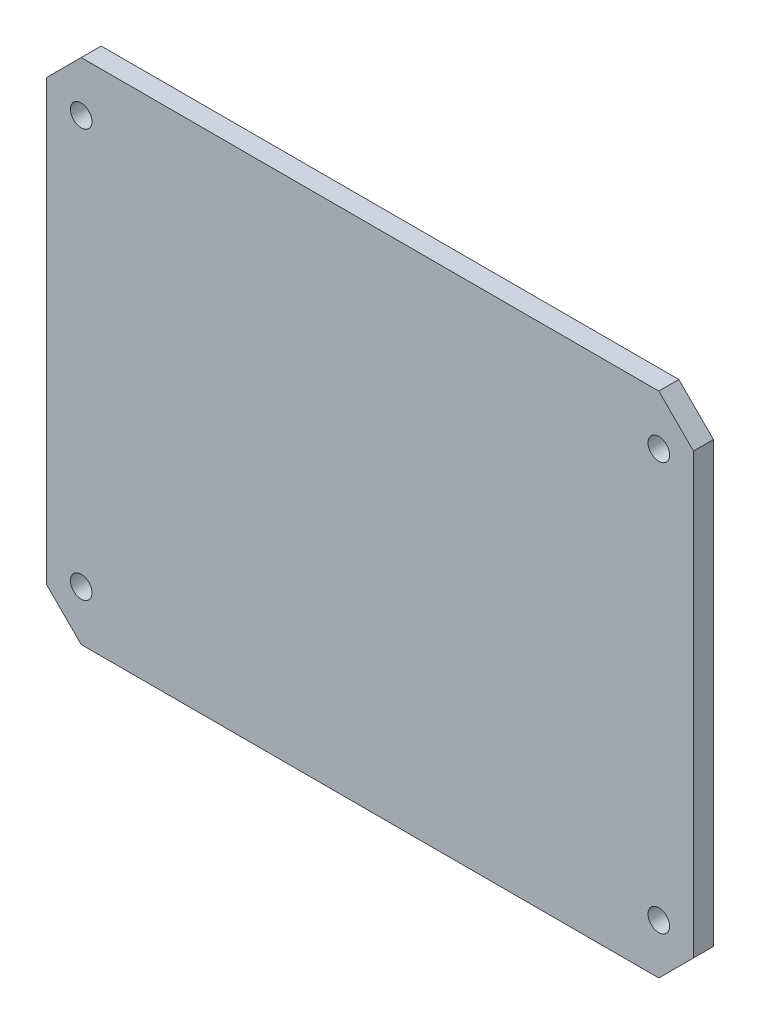
ISO-10303-21;
HEADER;
FILE_DESCRIPTION(('STEP AP214'),'2;1');
FILE_NAME('part.step','',(''),(''),'','','');
FILE_SCHEMA(('AUTOMOTIVE_DESIGN { 1 0 10303 214 1 1 1 1 }'));
ENDSEC;
DATA;
#1=APPLICATION_CONTEXT('core data for automotive mechanical design processes');
#2=APPLICATION_PROTOCOL_DEFINITION('international standard','automotive_design',2000,#1);
#3=PRODUCT_CONTEXT('',#1,'mechanical');
#4=PRODUCT('Part','Part','',(#3));
#5=PRODUCT_RELATED_PRODUCT_CATEGORY('part','',(#4));
#6=PRODUCT_DEFINITION_FORMATION('','',#4);
#7=PRODUCT_DEFINITION_CONTEXT('part definition',#1,'design');
#8=PRODUCT_DEFINITION('design','',#6,#7);
#9=PRODUCT_DEFINITION_SHAPE('','',#8);
#10=(LENGTH_UNIT() NAMED_UNIT(*) SI_UNIT(.MILLI.,.METRE.));
#11=(NAMED_UNIT(*) PLANE_ANGLE_UNIT() SI_UNIT($,.RADIAN.));
#12=(NAMED_UNIT(*) SI_UNIT($,.STERADIAN.) SOLID_ANGLE_UNIT());
#13=UNCERTAINTY_MEASURE_WITH_UNIT(LENGTH_MEASURE(1.E-05),#10,'distance_accuracy_value','');
#14=(GEOMETRIC_REPRESENTATION_CONTEXT(3) GLOBAL_UNCERTAINTY_ASSIGNED_CONTEXT((#13)) GLOBAL_UNIT_ASSIGNED_CONTEXT((#10,
#11,#12)) REPRESENTATION_CONTEXT('',''));
#15=CARTESIAN_POINT('',(0.,0.,0.));
#16=DIRECTION('',(0.,0.,1.));
#17=DIRECTION('',(1.,0.,0.));
#18=AXIS2_PLACEMENT_3D('',#15,#16,#17);
#19=CARTESIAN_POINT('',(0.,0.,2.6));
#20=DIRECTION('',(0.,0.,1.));
#21=DIRECTION('',(1.,0.,0.));
#22=AXIS2_PLACEMENT_3D('',#19,#20,#21);
#23=PLANE('',#22);
#24=CARTESIAN_POINT('',(-37.5,26.5,2.6));
#25=DIRECTION('',(0.,0.,1.));
#26=DIRECTION('',(1.,0.,0.));
#27=AXIS2_PLACEMENT_3D('',#24,#25,#26);
#28=CIRCLE('',#27,1.4);
#29=CARTESIAN_POINT('',(-36.1,26.5,2.6));
#30=VERTEX_POINT('',#29);
#31=EDGE_CURVE('E198',#30,#30,#28,.T.);
#32=ORIENTED_EDGE('',*,*,#31,.F.);
#33=EDGE_LOOP('',(#32));
#34=FACE_BOUND('',#33,.T.);
#35=CARTESIAN_POINT('',(-37.5,-26.5,2.6));
#36=DIRECTION('',(0.,0.,1.));
#37=DIRECTION('',(1.,0.,0.));
#38=AXIS2_PLACEMENT_3D('',#35,#36,#37);
#39=CIRCLE('',#38,1.4);
#40=CARTESIAN_POINT('',(-36.1,-26.5,2.6));
#41=VERTEX_POINT('',#40);
#42=EDGE_CURVE('E144',#41,#41,#39,.T.);
#43=ORIENTED_EDGE('',*,*,#42,.F.);
#44=EDGE_LOOP('',(#43));
#45=FACE_BOUND('',#44,.T.);
#46=DIRECTION('',(0.707106781186548,-0.707106781186547,0.));
#47=VECTOR('',#46,1.);
#48=CARTESIAN_POINT('',(-42.,-28.5,2.6));
#49=LINE('',#48,#47);
#50=CARTESIAN_POINT('',(-42.,-28.5,2.6));
#51=VERTEX_POINT('',#50);
#52=CARTESIAN_POINT('',(-37.5,-33.,2.6));
#53=VERTEX_POINT('',#52);
#54=EDGE_CURVE('E155',#51,#53,#49,.T.);
#55=ORIENTED_EDGE('',*,*,#54,.T.);
#56=DIRECTION('',(1.,0.,0.));
#57=VECTOR('',#56,1.);
#58=CARTESIAN_POINT('',(-37.5,-33.,2.6));
#59=LINE('',#58,#57);
#60=CARTESIAN_POINT('',(37.5,-33.,2.6));
#61=VERTEX_POINT('',#60);
#62=EDGE_CURVE('E103',#53,#61,#59,.T.);
#63=ORIENTED_EDGE('',*,*,#62,.T.);
#64=DIRECTION('',(0.707106781186548,0.707106781186547,0.));
#65=VECTOR('',#64,1.);
#66=CARTESIAN_POINT('',(37.5,-33.,2.6));
#67=LINE('',#66,#65);
#68=CARTESIAN_POINT('',(42.,-28.5,2.6));
#69=VERTEX_POINT('',#68);
#70=EDGE_CURVE('E170',#61,#69,#67,.T.);
#71=ORIENTED_EDGE('',*,*,#70,.T.);
#72=DIRECTION('',(0.,1.,0.));
#73=VECTOR('',#72,1.);
#74=CARTESIAN_POINT('',(42.,-28.5,2.6));
#75=LINE('',#74,#73);
#76=CARTESIAN_POINT('',(42.,28.5,2.6));
#77=VERTEX_POINT('',#76);
#78=EDGE_CURVE('E183',#69,#77,#75,.T.);
#79=ORIENTED_EDGE('',*,*,#78,.T.);
#80=DIRECTION('',(-0.707106781186548,0.707106781186547,0.));
#81=VECTOR('',#80,1.);
#82=CARTESIAN_POINT('',(42.,28.5,2.6));
#83=LINE('',#82,#81);
#84=CARTESIAN_POINT('',(37.5,33.,2.6));
#85=VERTEX_POINT('',#84);
#86=EDGE_CURVE('E122',#77,#85,#83,.T.);
#87=ORIENTED_EDGE('',*,*,#86,.T.);
#88=DIRECTION('',(-1.,0.,0.));
#89=VECTOR('',#88,1.);
#90=CARTESIAN_POINT('',(37.5,33.,2.6));
#91=LINE('',#90,#89);
#92=CARTESIAN_POINT('',(-37.5,33.,2.6));
#93=VERTEX_POINT('',#92);
#94=EDGE_CURVE('E116',#85,#93,#91,.T.);
#95=ORIENTED_EDGE('',*,*,#94,.T.);
#96=DIRECTION('',(-0.707106781186548,-0.707106781186547,0.));
#97=VECTOR('',#96,1.);
#98=CARTESIAN_POINT('',(-37.5,33.,2.6));
#99=LINE('',#98,#97);
#100=CARTESIAN_POINT('',(-42.,28.5,2.6));
#101=VERTEX_POINT('',#100);
#102=EDGE_CURVE('E120',#93,#101,#99,.T.);
#103=ORIENTED_EDGE('',*,*,#102,.T.);
#104=DIRECTION('',(0.,-1.,0.));
#105=VECTOR('',#104,1.);
#106=CARTESIAN_POINT('',(-42.,28.5,2.6));
#107=LINE('',#106,#105);
#108=EDGE_CURVE('E60',#101,#51,#107,.T.);
#109=ORIENTED_EDGE('',*,*,#108,.T.);
#110=EDGE_LOOP('',(#55,#63,#71,#79,#87,#95,#103,#109));
#111=FACE_BOUND('',#110,.T.);
#112=CARTESIAN_POINT('',(37.5,-26.5,2.6));
#113=DIRECTION('',(0.,0.,1.));
#114=DIRECTION('',(1.,0.,0.));
#115=AXIS2_PLACEMENT_3D('',#112,#113,#114);
#116=CIRCLE('',#115,1.4);
#117=CARTESIAN_POINT('',(38.9,-26.5,2.6));
#118=VERTEX_POINT('',#117);
#119=EDGE_CURVE('E192',#118,#118,#116,.T.);
#120=ORIENTED_EDGE('',*,*,#119,.F.);
#121=EDGE_LOOP('',(#120));
#122=FACE_BOUND('',#121,.T.);
#123=CARTESIAN_POINT('',(37.5,26.5,2.6));
#124=DIRECTION('',(0.,0.,1.));
#125=DIRECTION('',(1.,0.,0.));
#126=AXIS2_PLACEMENT_3D('',#123,#124,#125);
#127=CIRCLE('',#126,1.4);
#128=CARTESIAN_POINT('',(38.9,26.5,2.6));
#129=VERTEX_POINT('',#128);
#130=EDGE_CURVE('E204',#129,#129,#127,.T.);
#131=ORIENTED_EDGE('',*,*,#130,.F.);
#132=EDGE_LOOP('',(#131));
#133=FACE_BOUND('',#132,.T.);
#134=ADVANCED_FACE('F43',(#34,#45,#111,#122,#133),#23,.T.);
#135=CARTESIAN_POINT('',(0.,0.,0.));
#136=DIRECTION('',(0.,0.,1.));
#137=DIRECTION('',(1.,0.,0.));
#138=AXIS2_PLACEMENT_3D('',#135,#136,#137);
#139=PLANE('',#138);
#140=DIRECTION('',(0.707106781186548,-0.707106781186547,0.));
#141=VECTOR('',#140,1.);
#142=CARTESIAN_POINT('',(-42.,-28.5,0.));
#143=LINE('',#142,#141);
#144=CARTESIAN_POINT('',(-42.,-28.5,0.));
#145=VERTEX_POINT('',#144);
#146=CARTESIAN_POINT('',(-37.5,-33.,0.));
#147=VERTEX_POINT('',#146);
#148=EDGE_CURVE('E140',#145,#147,#143,.T.);
#149=ORIENTED_EDGE('',*,*,#148,.F.);
#150=DIRECTION('',(0.,-1.,0.));
#151=VECTOR('',#150,1.);
#152=CARTESIAN_POINT('',(-42.,28.5,0.));
#153=LINE('',#152,#151);
#154=CARTESIAN_POINT('',(-42.,28.5,0.));
#155=VERTEX_POINT('',#154);
#156=EDGE_CURVE('E95',#155,#145,#153,.T.);
#157=ORIENTED_EDGE('',*,*,#156,.F.);
#158=DIRECTION('',(-0.707106781186548,-0.707106781186547,0.));
#159=VECTOR('',#158,1.);
#160=CARTESIAN_POINT('',(-37.5,33.,0.));
#161=LINE('',#160,#159);
#162=CARTESIAN_POINT('',(-37.5,33.,0.));
#163=VERTEX_POINT('',#162);
#164=EDGE_CURVE('E89',#163,#155,#161,.T.);
#165=ORIENTED_EDGE('',*,*,#164,.F.);
#166=DIRECTION('',(-1.,0.,0.));
#167=VECTOR('',#166,1.);
#168=CARTESIAN_POINT('',(37.5,33.,0.));
#169=LINE('',#168,#167);
#170=CARTESIAN_POINT('',(37.5,33.,0.));
#171=VERTEX_POINT('',#170);
#172=EDGE_CURVE('E130',#171,#163,#169,.T.);
#173=ORIENTED_EDGE('',*,*,#172,.F.);
#174=DIRECTION('',(-0.707106781186548,0.707106781186547,0.));
#175=VECTOR('',#174,1.);
#176=CARTESIAN_POINT('',(42.,28.5,0.));
#177=LINE('',#176,#175);
#178=CARTESIAN_POINT('',(42.,28.5,0.));
#179=VERTEX_POINT('',#178);
#180=EDGE_CURVE('E150',#179,#171,#177,.T.);
#181=ORIENTED_EDGE('',*,*,#180,.F.);
#182=DIRECTION('',(0.,1.,0.));
#183=VECTOR('',#182,1.);
#184=CARTESIAN_POINT('',(42.,-28.5,0.));
#185=LINE('',#184,#183);
#186=CARTESIAN_POINT('',(42.,-28.5,0.));
#187=VERTEX_POINT('',#186);
#188=EDGE_CURVE('E148',#187,#179,#185,.T.);
#189=ORIENTED_EDGE('',*,*,#188,.F.);
#190=DIRECTION('',(0.707106781186548,0.707106781186547,0.));
#191=VECTOR('',#190,1.);
#192=CARTESIAN_POINT('',(37.5,-33.,0.));
#193=LINE('',#192,#191);
#194=CARTESIAN_POINT('',(37.5,-33.,0.));
#195=VERTEX_POINT('',#194);
#196=EDGE_CURVE('E146',#195,#187,#193,.T.);
#197=ORIENTED_EDGE('',*,*,#196,.F.);
#198=DIRECTION('',(1.,0.,0.));
#199=VECTOR('',#198,1.);
#200=CARTESIAN_POINT('',(-37.5,-33.,0.));
#201=LINE('',#200,#199);
#202=EDGE_CURVE('E143',#147,#195,#201,.T.);
#203=ORIENTED_EDGE('',*,*,#202,.F.);
#204=EDGE_LOOP('',(#149,#157,#165,#173,#181,#189,#197,#203));
#205=FACE_BOUND('',#204,.T.);
#206=CARTESIAN_POINT('',(-37.5,-26.5,0.));
#207=DIRECTION('',(0.,0.,1.));
#208=DIRECTION('',(1.,0.,0.));
#209=AXIS2_PLACEMENT_3D('',#206,#207,#208);
#210=CIRCLE('',#209,1.4);
#211=CARTESIAN_POINT('',(-36.1,-26.5,0.));
#212=VERTEX_POINT('',#211);
#213=EDGE_CURVE('E189',#212,#212,#210,.T.);
#214=ORIENTED_EDGE('',*,*,#213,.T.);
#215=EDGE_LOOP('',(#214));
#216=FACE_BOUND('',#215,.T.);
#217=CARTESIAN_POINT('',(37.5,-26.5,0.));
#218=DIRECTION('',(0.,0.,1.));
#219=DIRECTION('',(1.,0.,0.));
#220=AXIS2_PLACEMENT_3D('',#217,#218,#219);
#221=CIRCLE('',#220,1.4);
#222=CARTESIAN_POINT('',(38.9,-26.5,0.));
#223=VERTEX_POINT('',#222);
#224=EDGE_CURVE('E195',#223,#223,#221,.T.);
#225=ORIENTED_EDGE('',*,*,#224,.T.);
#226=EDGE_LOOP('',(#225));
#227=FACE_BOUND('',#226,.T.);
#228=CARTESIAN_POINT('',(-37.5,26.5,0.));
#229=DIRECTION('',(0.,0.,1.));
#230=DIRECTION('',(1.,0.,0.));
#231=AXIS2_PLACEMENT_3D('',#228,#229,#230);
#232=CIRCLE('',#231,1.4);
#233=CARTESIAN_POINT('',(-36.1,26.5,0.));
#234=VERTEX_POINT('',#233);
#235=EDGE_CURVE('E201',#234,#234,#232,.T.);
#236=ORIENTED_EDGE('',*,*,#235,.T.);
#237=EDGE_LOOP('',(#236));
#238=FACE_BOUND('',#237,.T.);
#239=CARTESIAN_POINT('',(37.5,26.5,0.));
#240=DIRECTION('',(0.,0.,1.));
#241=DIRECTION('',(1.,0.,0.));
#242=AXIS2_PLACEMENT_3D('',#239,#240,#241);
#243=CIRCLE('',#242,1.4);
#244=CARTESIAN_POINT('',(38.9,26.5,0.));
#245=VERTEX_POINT('',#244);
#246=EDGE_CURVE('E207',#245,#245,#243,.T.);
#247=ORIENTED_EDGE('',*,*,#246,.T.);
#248=EDGE_LOOP('',(#247));
#249=FACE_BOUND('',#248,.T.);
#250=ADVANCED_FACE('F174',(#205,#216,#227,#238,#249),#139,.F.);
#251=CARTESIAN_POINT('',(-42.,-28.5,2.6));
#252=DIRECTION('',(0.707106781186547,0.707106781186548,0.));
#253=DIRECTION('',(-0.707106781186548,0.707106781186547,0.));
#254=AXIS2_PLACEMENT_3D('',#251,#252,#253);
#255=PLANE('',#254);
#256=ORIENTED_EDGE('',*,*,#148,.T.);
#257=DIRECTION('',(0.,0.,-1.));
#258=VECTOR('',#257,1.);
#259=CARTESIAN_POINT('',(-37.5,-33.,2.6));
#260=LINE('',#259,#258);
#261=EDGE_CURVE('E11',#53,#147,#260,.T.);
#262=ORIENTED_EDGE('',*,*,#261,.F.);
#263=ORIENTED_EDGE('',*,*,#54,.F.);
#264=DIRECTION('',(0.,0.,-1.));
#265=VECTOR('',#264,1.);
#266=CARTESIAN_POINT('',(-42.,-28.5,2.6));
#267=LINE('',#266,#265);
#268=EDGE_CURVE('E136',#51,#145,#267,.T.);
#269=ORIENTED_EDGE('',*,*,#268,.T.);
#270=EDGE_LOOP('',(#256,#262,#263,#269));
#271=FACE_BOUND('',#270,.T.);
#272=ADVANCED_FACE('F45',(#271),#255,.F.);
#273=CARTESIAN_POINT('',(-37.5,-33.,2.6));
#274=DIRECTION('',(0.,1.,0.));
#275=DIRECTION('',(0.,0.,1.));
#276=AXIS2_PLACEMENT_3D('',#273,#274,#275);
#277=PLANE('',#276);
#278=ORIENTED_EDGE('',*,*,#202,.T.);
#279=DIRECTION('',(0.,0.,-1.));
#280=VECTOR('',#279,1.);
#281=CARTESIAN_POINT('',(37.5,-33.,2.6));
#282=LINE('',#281,#280);
#283=EDGE_CURVE('E52',#61,#195,#282,.T.);
#284=ORIENTED_EDGE('',*,*,#283,.F.);
#285=ORIENTED_EDGE('',*,*,#62,.F.);
#286=ORIENTED_EDGE('',*,*,#261,.T.);
#287=EDGE_LOOP('',(#278,#284,#285,#286));
#288=FACE_BOUND('',#287,.T.);
#289=ADVANCED_FACE('F241',(#288),#277,.F.);
#290=CARTESIAN_POINT('',(37.5,-33.,2.6));
#291=DIRECTION('',(-0.707106781186547,0.707106781186548,0.));
#292=DIRECTION('',(-0.707106781186548,-0.707106781186547,0.));
#293=AXIS2_PLACEMENT_3D('',#290,#291,#292);
#294=PLANE('',#293);
#295=ORIENTED_EDGE('',*,*,#196,.T.);
#296=DIRECTION('',(0.,0.,-1.));
#297=VECTOR('',#296,1.);
#298=CARTESIAN_POINT('',(42.,-28.5,2.6));
#299=LINE('',#298,#297);
#300=EDGE_CURVE('E162',#69,#187,#299,.T.);
#301=ORIENTED_EDGE('',*,*,#300,.F.);
#302=ORIENTED_EDGE('',*,*,#70,.F.);
#303=ORIENTED_EDGE('',*,*,#283,.T.);
#304=EDGE_LOOP('',(#295,#301,#302,#303));
#305=FACE_BOUND('',#304,.T.);
#306=ADVANCED_FACE('F168',(#305),#294,.F.);
#307=CARTESIAN_POINT('',(42.,-28.5,2.6));
#308=DIRECTION('',(-1.,0.,0.));
#309=DIRECTION('',(0.,0.,1.));
#310=AXIS2_PLACEMENT_3D('',#307,#308,#309);
#311=PLANE('',#310);
#312=ORIENTED_EDGE('',*,*,#188,.T.);
#313=DIRECTION('',(0.,0.,-1.));
#314=VECTOR('',#313,1.);
#315=CARTESIAN_POINT('',(42.,28.5,2.6));
#316=LINE('',#315,#314);
#317=EDGE_CURVE('E159',#77,#179,#316,.T.);
#318=ORIENTED_EDGE('',*,*,#317,.F.);
#319=ORIENTED_EDGE('',*,*,#78,.F.);
#320=ORIENTED_EDGE('',*,*,#300,.T.);
#321=EDGE_LOOP('',(#312,#318,#319,#320));
#322=FACE_BOUND('',#321,.T.);
#323=ADVANCED_FACE('F179',(#322),#311,.F.);
#324=CARTESIAN_POINT('',(42.,28.5,2.6));
#325=DIRECTION('',(-0.707106781186547,-0.707106781186548,0.));
#326=DIRECTION('',(0.707106781186548,-0.707106781186547,0.));
#327=AXIS2_PLACEMENT_3D('',#324,#325,#326);
#328=PLANE('',#327);
#329=ORIENTED_EDGE('',*,*,#180,.T.);
#330=DIRECTION('',(0.,0.,-1.));
#331=VECTOR('',#330,1.);
#332=CARTESIAN_POINT('',(37.5,33.,2.6));
#333=LINE('',#332,#331);
#334=EDGE_CURVE('E131',#85,#171,#333,.T.);
#335=ORIENTED_EDGE('',*,*,#334,.F.);
#336=ORIENTED_EDGE('',*,*,#86,.F.);
#337=ORIENTED_EDGE('',*,*,#317,.T.);
#338=EDGE_LOOP('',(#329,#335,#336,#337));
#339=FACE_BOUND('',#338,.T.);
#340=ADVANCED_FACE('F182',(#339),#328,.F.);
#341=CARTESIAN_POINT('',(37.5,33.,2.6));
#342=DIRECTION('',(0.,-1.,0.));
#343=DIRECTION('',(0.,0.,-1.));
#344=AXIS2_PLACEMENT_3D('',#341,#342,#343);
#345=PLANE('',#344);
#346=ORIENTED_EDGE('',*,*,#172,.T.);
#347=DIRECTION('',(0.,0.,-1.));
#348=VECTOR('',#347,1.);
#349=CARTESIAN_POINT('',(-37.5,33.,2.6));
#350=LINE('',#349,#348);
#351=EDGE_CURVE('E127',#93,#163,#350,.T.);
#352=ORIENTED_EDGE('',*,*,#351,.F.);
#353=ORIENTED_EDGE('',*,*,#94,.F.);
#354=ORIENTED_EDGE('',*,*,#334,.T.);
#355=EDGE_LOOP('',(#346,#352,#353,#354));
#356=FACE_BOUND('',#355,.T.);
#357=ADVANCED_FACE('F128',(#356),#345,.F.);
#358=CARTESIAN_POINT('',(-37.5,33.,2.6));
#359=DIRECTION('',(0.707106781186547,-0.707106781186548,0.));
#360=DIRECTION('',(0.707106781186548,0.707106781186547,0.));
#361=AXIS2_PLACEMENT_3D('',#358,#359,#360);
#362=PLANE('',#361);
#363=ORIENTED_EDGE('',*,*,#164,.T.);
#364=DIRECTION('',(0.,0.,-1.));
#365=VECTOR('',#364,1.);
#366=CARTESIAN_POINT('',(-42.,28.5,2.6));
#367=LINE('',#366,#365);
#368=EDGE_CURVE('E132',#101,#155,#367,.T.);
#369=ORIENTED_EDGE('',*,*,#368,.F.);
#370=ORIENTED_EDGE('',*,*,#102,.F.);
#371=ORIENTED_EDGE('',*,*,#351,.T.);
#372=EDGE_LOOP('',(#363,#369,#370,#371));
#373=FACE_BOUND('',#372,.T.);
#374=ADVANCED_FACE('F134',(#373),#362,.F.);
#375=CARTESIAN_POINT('',(-42.,28.5,2.6));
#376=DIRECTION('',(1.,0.,0.));
#377=DIRECTION('',(0.,0.,-1.));
#378=AXIS2_PLACEMENT_3D('',#375,#376,#377);
#379=PLANE('',#378);
#380=ORIENTED_EDGE('',*,*,#156,.T.);
#381=ORIENTED_EDGE('',*,*,#268,.F.);
#382=ORIENTED_EDGE('',*,*,#108,.F.);
#383=ORIENTED_EDGE('',*,*,#368,.T.);
#384=EDGE_LOOP('',(#380,#381,#382,#383));
#385=FACE_BOUND('',#384,.T.);
#386=ADVANCED_FACE('F229',(#385),#379,.F.);
#387=CARTESIAN_POINT('',(-37.5,-26.5,2.6));
#388=DIRECTION('',(0.,0.,-1.));
#389=DIRECTION('',(-1.,0.,0.));
#390=AXIS2_PLACEMENT_3D('',#387,#388,#389);
#391=CYLINDRICAL_SURFACE('',#390,1.4);
#392=ORIENTED_EDGE('',*,*,#42,.T.);
#393=EDGE_LOOP('',(#392));
#394=FACE_BOUND('',#393,.T.);
#395=ORIENTED_EDGE('',*,*,#213,.F.);
#396=EDGE_LOOP('',(#395));
#397=FACE_BOUND('',#396,.T.);
#398=ADVANCED_FACE('F226',(#394,#397),#391,.F.);
#399=CARTESIAN_POINT('',(37.5,-26.5,2.6));
#400=DIRECTION('',(0.,0.,-1.));
#401=DIRECTION('',(-1.,0.,0.));
#402=AXIS2_PLACEMENT_3D('',#399,#400,#401);
#403=CYLINDRICAL_SURFACE('',#402,1.4);
#404=ORIENTED_EDGE('',*,*,#119,.T.);
#405=EDGE_LOOP('',(#404));
#406=FACE_BOUND('',#405,.T.);
#407=ORIENTED_EDGE('',*,*,#224,.F.);
#408=EDGE_LOOP('',(#407));
#409=FACE_BOUND('',#408,.T.);
#410=ADVANCED_FACE('F304',(#406,#409),#403,.F.);
#411=CARTESIAN_POINT('',(-37.5,26.5,2.6));
#412=DIRECTION('',(0.,0.,-1.));
#413=DIRECTION('',(-1.,0.,0.));
#414=AXIS2_PLACEMENT_3D('',#411,#412,#413);
#415=CYLINDRICAL_SURFACE('',#414,1.4);
#416=ORIENTED_EDGE('',*,*,#31,.T.);
#417=EDGE_LOOP('',(#416));
#418=FACE_BOUND('',#417,.T.);
#419=ORIENTED_EDGE('',*,*,#235,.F.);
#420=EDGE_LOOP('',(#419));
#421=FACE_BOUND('',#420,.T.);
#422=ADVANCED_FACE('F312',(#418,#421),#415,.F.);
#423=CARTESIAN_POINT('',(37.5,26.5,2.6));
#424=DIRECTION('',(0.,0.,-1.));
#425=DIRECTION('',(-1.,0.,0.));
#426=AXIS2_PLACEMENT_3D('',#423,#424,#425);
#427=CYLINDRICAL_SURFACE('',#426,1.4);
#428=ORIENTED_EDGE('',*,*,#130,.T.);
#429=EDGE_LOOP('',(#428));
#430=FACE_BOUND('',#429,.T.);
#431=ORIENTED_EDGE('',*,*,#246,.F.);
#432=EDGE_LOOP('',(#431));
#433=FACE_BOUND('',#432,.T.);
#434=ADVANCED_FACE('F213',(#430,#433),#427,.F.);
#435=CLOSED_SHELL('',(#134,#250,#272,#289,#306,#323,#340,#357,#374,#386,#398,#410,#422,#434));
#436=MANIFOLD_SOLID_BREP('B2',#435);
#437=ADVANCED_BREP_SHAPE_REPRESENTATION('',(#18,#436),#14);
#438=SHAPE_DEFINITION_REPRESENTATION(#9,#437);
ENDSEC;
END-ISO-10303-21;
